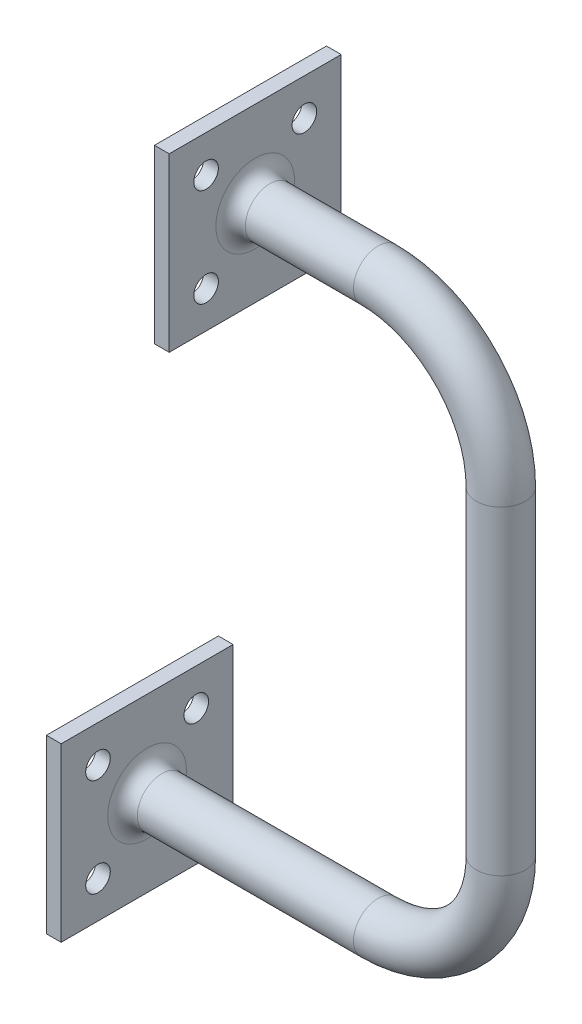
ISO-10303-21;
HEADER;
FILE_DESCRIPTION(('STEP AP214'),'2;1');
FILE_NAME('part.step','',(''),(''),'','','');
FILE_SCHEMA(('AUTOMOTIVE_DESIGN { 1 0 10303 214 1 1 1 1 }'));
ENDSEC;
DATA;
#1=APPLICATION_CONTEXT('core data for automotive mechanical design processes');
#2=APPLICATION_PROTOCOL_DEFINITION('international standard','automotive_design',2000,#1);
#3=PRODUCT_CONTEXT('',#1,'mechanical');
#4=PRODUCT('Part','Part','',(#3));
#5=PRODUCT_RELATED_PRODUCT_CATEGORY('part','',(#4));
#6=PRODUCT_DEFINITION_FORMATION('','',#4);
#7=PRODUCT_DEFINITION_CONTEXT('part definition',#1,'design');
#8=PRODUCT_DEFINITION('design','',#6,#7);
#9=PRODUCT_DEFINITION_SHAPE('','',#8);
#10=(LENGTH_UNIT() NAMED_UNIT(*) SI_UNIT(.MILLI.,.METRE.));
#11=(NAMED_UNIT(*) PLANE_ANGLE_UNIT() SI_UNIT($,.RADIAN.));
#12=(NAMED_UNIT(*) SI_UNIT($,.STERADIAN.) SOLID_ANGLE_UNIT());
#13=UNCERTAINTY_MEASURE_WITH_UNIT(LENGTH_MEASURE(1.E-05),#10,'distance_accuracy_value','');
#14=(GEOMETRIC_REPRESENTATION_CONTEXT(3) GLOBAL_UNCERTAINTY_ASSIGNED_CONTEXT((#13)) GLOBAL_UNIT_ASSIGNED_CONTEXT((#10,
#11,#12)) REPRESENTATION_CONTEXT('',''));
#15=CARTESIAN_POINT('',(0.,0.,0.));
#16=DIRECTION('',(0.,0.,1.));
#17=DIRECTION('',(1.,0.,0.));
#18=AXIS2_PLACEMENT_3D('',#15,#16,#17);
#19=CARTESIAN_POINT('',(3.,0.,0.));
#20=DIRECTION('',(-1.,0.,0.));
#21=DIRECTION('',(0.,0.,1.));
#22=AXIS2_PLACEMENT_3D('',#19,#20,#21);
#23=PLANE('',#22);
#24=CARTESIAN_POINT('',(3.,0.,0.));
#25=DIRECTION('',(-1.,0.,0.));
#26=DIRECTION('',(0.,0.,1.));
#27=AXIS2_PLACEMENT_3D('',#24,#25,#26);
#28=CIRCLE('',#27,8.);
#29=CARTESIAN_POINT('',(3.,0.,8.));
#30=VERTEX_POINT('',#29);
#31=EDGE_CURVE('E11',#30,#30,#28,.T.);
#32=ORIENTED_EDGE('',*,*,#31,.T.);
#33=EDGE_LOOP('',(#32));
#34=FACE_BOUND('',#33,.T.);
#35=CARTESIAN_POINT('',(3.,-10.,10.));
#36=DIRECTION('',(1.,0.,0.));
#37=DIRECTION('',(0.,0.,-1.));
#38=AXIS2_PLACEMENT_3D('',#35,#36,#37);
#39=CIRCLE('',#38,2.5);
#40=CARTESIAN_POINT('',(3.,-10.,7.5));
#41=VERTEX_POINT('',#40);
#42=EDGE_CURVE('E194',#41,#41,#39,.T.);
#43=ORIENTED_EDGE('',*,*,#42,.F.);
#44=EDGE_LOOP('',(#43));
#45=FACE_BOUND('',#44,.T.);
#46=CARTESIAN_POINT('',(3.,-10.,-10.));
#47=DIRECTION('',(1.,0.,0.));
#48=DIRECTION('',(0.,0.,-1.));
#49=AXIS2_PLACEMENT_3D('',#46,#47,#48);
#50=CIRCLE('',#49,2.5);
#51=CARTESIAN_POINT('',(3.,-10.,-12.5));
#52=VERTEX_POINT('',#51);
#53=EDGE_CURVE('E188',#52,#52,#50,.T.);
#54=ORIENTED_EDGE('',*,*,#53,.F.);
#55=EDGE_LOOP('',(#54));
#56=FACE_BOUND('',#55,.T.);
#57=DIRECTION('',(0.,1.,0.));
#58=VECTOR('',#57,1.);
#59=CARTESIAN_POINT('',(3.,-17.5,-17.5));
#60=LINE('',#59,#58);
#61=CARTESIAN_POINT('',(3.,-17.5,-17.5));
#62=VERTEX_POINT('',#61);
#63=CARTESIAN_POINT('',(3.,17.5,-17.5));
#64=VERTEX_POINT('',#63);
#65=EDGE_CURVE('E165',#62,#64,#60,.T.);
#66=ORIENTED_EDGE('',*,*,#65,.T.);
#67=DIRECTION('',(0.,0.,1.));
#68=VECTOR('',#67,1.);
#69=CARTESIAN_POINT('',(3.,17.5,17.5));
#70=LINE('',#69,#68);
#71=CARTESIAN_POINT('',(3.,17.5,17.5));
#72=VERTEX_POINT('',#71);
#73=EDGE_CURVE('E82',#64,#72,#70,.T.);
#74=ORIENTED_EDGE('',*,*,#73,.T.);
#75=DIRECTION('',(0.,-1.,0.));
#76=VECTOR('',#75,1.);
#77=CARTESIAN_POINT('',(3.,-17.5,17.5));
#78=LINE('',#77,#76);
#79=CARTESIAN_POINT('',(3.,-17.5,17.5));
#80=VERTEX_POINT('',#79);
#81=EDGE_CURVE('E168',#72,#80,#78,.T.);
#82=ORIENTED_EDGE('',*,*,#81,.T.);
#83=DIRECTION('',(0.,0.,-1.));
#84=VECTOR('',#83,1.);
#85=CARTESIAN_POINT('',(3.,-17.5,17.5));
#86=LINE('',#85,#84);
#87=EDGE_CURVE('E50',#80,#62,#86,.T.);
#88=ORIENTED_EDGE('',*,*,#87,.T.);
#89=EDGE_LOOP('',(#66,#74,#82,#88));
#90=FACE_BOUND('',#89,.T.);
#91=CARTESIAN_POINT('',(3.,10.,-10.));
#92=DIRECTION('',(1.,0.,0.));
#93=DIRECTION('',(0.,0.,-1.));
#94=AXIS2_PLACEMENT_3D('',#91,#92,#93);
#95=CIRCLE('',#94,2.5);
#96=CARTESIAN_POINT('',(3.,10.,-12.5));
#97=VERTEX_POINT('',#96);
#98=EDGE_CURVE('E158',#97,#97,#95,.T.);
#99=ORIENTED_EDGE('',*,*,#98,.F.);
#100=EDGE_LOOP('',(#99));
#101=FACE_BOUND('',#100,.T.);
#102=CARTESIAN_POINT('',(3.,10.,10.));
#103=DIRECTION('',(1.,0.,0.));
#104=DIRECTION('',(0.,0.,-1.));
#105=AXIS2_PLACEMENT_3D('',#102,#103,#104);
#106=CIRCLE('',#105,2.5);
#107=CARTESIAN_POINT('',(3.,10.,7.5));
#108=VERTEX_POINT('',#107);
#109=EDGE_CURVE('E155',#108,#108,#106,.T.);
#110=ORIENTED_EDGE('',*,*,#109,.F.);
#111=EDGE_LOOP('',(#110));
#112=FACE_BOUND('',#111,.T.);
#113=ADVANCED_FACE('F33',(#34,#45,#56,#90,#101,#112),#23,.F.);
#114=CARTESIAN_POINT('',(3.,-17.5,-17.5));
#115=DIRECTION('',(0.,0.,1.));
#116=DIRECTION('',(1.,0.,0.));
#117=AXIS2_PLACEMENT_3D('',#114,#115,#116);
#118=PLANE('',#117);
#119=DIRECTION('',(0.,1.,0.));
#120=VECTOR('',#119,1.);
#121=CARTESIAN_POINT('',(0.,-17.5,-17.5));
#122=LINE('',#121,#120);
#123=CARTESIAN_POINT('',(0.,-17.5,-17.5));
#124=VERTEX_POINT('',#123);
#125=CARTESIAN_POINT('',(0.,17.5,-17.5));
#126=VERTEX_POINT('',#125);
#127=EDGE_CURVE('E162',#124,#126,#122,.T.);
#128=ORIENTED_EDGE('',*,*,#127,.T.);
#129=DIRECTION('',(-1.,0.,0.));
#130=VECTOR('',#129,1.);
#131=CARTESIAN_POINT('',(3.,17.5,-17.5));
#132=LINE('',#131,#130);
#133=EDGE_CURVE('E183',#64,#126,#132,.T.);
#134=ORIENTED_EDGE('',*,*,#133,.F.);
#135=ORIENTED_EDGE('',*,*,#65,.F.);
#136=DIRECTION('',(-1.,0.,0.));
#137=VECTOR('',#136,1.);
#138=CARTESIAN_POINT('',(3.,-17.5,-17.5));
#139=LINE('',#138,#137);
#140=EDGE_CURVE('E171',#62,#124,#139,.T.);
#141=ORIENTED_EDGE('',*,*,#140,.T.);
#142=EDGE_LOOP('',(#128,#134,#135,#141));
#143=FACE_BOUND('',#142,.T.);
#144=ADVANCED_FACE('F234',(#143),#118,.F.);
#145=CARTESIAN_POINT('',(3.,17.5,17.5));
#146=DIRECTION('',(0.,-1.,0.));
#147=DIRECTION('',(0.,0.,-1.));
#148=AXIS2_PLACEMENT_3D('',#145,#146,#147);
#149=PLANE('',#148);
#150=DIRECTION('',(0.,0.,1.));
#151=VECTOR('',#150,1.);
#152=CARTESIAN_POINT('',(0.,17.5,17.5));
#153=LINE('',#152,#151);
#154=CARTESIAN_POINT('',(0.,17.5,17.5));
#155=VERTEX_POINT('',#154);
#156=EDGE_CURVE('E174',#126,#155,#153,.T.);
#157=ORIENTED_EDGE('',*,*,#156,.T.);
#158=DIRECTION('',(-1.,0.,0.));
#159=VECTOR('',#158,1.);
#160=CARTESIAN_POINT('',(3.,17.5,17.5));
#161=LINE('',#160,#159);
#162=EDGE_CURVE('E181',#72,#155,#161,.T.);
#163=ORIENTED_EDGE('',*,*,#162,.F.);
#164=ORIENTED_EDGE('',*,*,#73,.F.);
#165=ORIENTED_EDGE('',*,*,#133,.T.);
#166=EDGE_LOOP('',(#157,#163,#164,#165));
#167=FACE_BOUND('',#166,.T.);
#168=ADVANCED_FACE('F242',(#167),#149,.F.);
#169=CARTESIAN_POINT('',(3.,-17.5,17.5));
#170=DIRECTION('',(0.,0.,-1.));
#171=DIRECTION('',(-1.,0.,0.));
#172=AXIS2_PLACEMENT_3D('',#169,#170,#171);
#173=PLANE('',#172);
#174=DIRECTION('',(0.,-1.,0.));
#175=VECTOR('',#174,1.);
#176=CARTESIAN_POINT('',(0.,-17.5,17.5));
#177=LINE('',#176,#175);
#178=CARTESIAN_POINT('',(0.,-17.5,17.5));
#179=VERTEX_POINT('',#178);
#180=EDGE_CURVE('E68',#155,#179,#177,.T.);
#181=ORIENTED_EDGE('',*,*,#180,.T.);
#182=DIRECTION('',(-1.,0.,0.));
#183=VECTOR('',#182,1.);
#184=CARTESIAN_POINT('',(3.,-17.5,17.5));
#185=LINE('',#184,#183);
#186=EDGE_CURVE('E179',#80,#179,#185,.T.);
#187=ORIENTED_EDGE('',*,*,#186,.F.);
#188=ORIENTED_EDGE('',*,*,#81,.F.);
#189=ORIENTED_EDGE('',*,*,#162,.T.);
#190=EDGE_LOOP('',(#181,#187,#188,#189));
#191=FACE_BOUND('',#190,.T.);
#192=ADVANCED_FACE('F257',(#191),#173,.F.);
#193=CARTESIAN_POINT('',(3.,-17.5,17.5));
#194=DIRECTION('',(0.,1.,0.));
#195=DIRECTION('',(0.,0.,1.));
#196=AXIS2_PLACEMENT_3D('',#193,#194,#195);
#197=PLANE('',#196);
#198=DIRECTION('',(0.,0.,-1.));
#199=VECTOR('',#198,1.);
#200=CARTESIAN_POINT('',(0.,-17.5,17.5));
#201=LINE('',#200,#199);
#202=EDGE_CURVE('E74',#179,#124,#201,.T.);
#203=ORIENTED_EDGE('',*,*,#202,.T.);
#204=ORIENTED_EDGE('',*,*,#140,.F.);
#205=ORIENTED_EDGE('',*,*,#87,.F.);
#206=ORIENTED_EDGE('',*,*,#186,.T.);
#207=EDGE_LOOP('',(#203,#204,#205,#206));
#208=FACE_BOUND('',#207,.T.);
#209=ADVANCED_FACE('F253',(#208),#197,.F.);
#210=CARTESIAN_POINT('',(0.,0.,0.));
#211=DIRECTION('',(-1.,0.,0.));
#212=DIRECTION('',(0.,0.,1.));
#213=AXIS2_PLACEMENT_3D('',#210,#211,#212);
#214=PLANE('',#213);
#215=CARTESIAN_POINT('',(0.,10.,10.));
#216=DIRECTION('',(1.,0.,0.));
#217=DIRECTION('',(0.,0.,-1.));
#218=AXIS2_PLACEMENT_3D('',#215,#216,#217);
#219=CIRCLE('',#218,2.5);
#220=CARTESIAN_POINT('',(0.,10.,7.5));
#221=VERTEX_POINT('',#220);
#222=EDGE_CURVE('E152',#221,#221,#219,.T.);
#223=ORIENTED_EDGE('',*,*,#222,.T.);
#224=EDGE_LOOP('',(#223));
#225=FACE_BOUND('',#224,.T.);
#226=CARTESIAN_POINT('',(0.,10.,-10.));
#227=DIRECTION('',(1.,0.,0.));
#228=DIRECTION('',(0.,0.,-1.));
#229=AXIS2_PLACEMENT_3D('',#226,#227,#228);
#230=CIRCLE('',#229,2.5);
#231=CARTESIAN_POINT('',(0.,10.,-12.5));
#232=VERTEX_POINT('',#231);
#233=EDGE_CURVE('E159',#232,#232,#230,.T.);
#234=ORIENTED_EDGE('',*,*,#233,.T.);
#235=EDGE_LOOP('',(#234));
#236=FACE_BOUND('',#235,.T.);
#237=ORIENTED_EDGE('',*,*,#127,.F.);
#238=ORIENTED_EDGE('',*,*,#202,.F.);
#239=ORIENTED_EDGE('',*,*,#180,.F.);
#240=ORIENTED_EDGE('',*,*,#156,.F.);
#241=EDGE_LOOP('',(#237,#238,#239,#240));
#242=FACE_BOUND('',#241,.T.);
#243=CARTESIAN_POINT('',(0.,-10.,-10.));
#244=DIRECTION('',(1.,0.,0.));
#245=DIRECTION('',(0.,0.,-1.));
#246=AXIS2_PLACEMENT_3D('',#243,#244,#245);
#247=CIRCLE('',#246,2.5);
#248=CARTESIAN_POINT('',(0.,-10.,-12.5));
#249=VERTEX_POINT('',#248);
#250=EDGE_CURVE('E185',#249,#249,#247,.T.);
#251=ORIENTED_EDGE('',*,*,#250,.T.);
#252=EDGE_LOOP('',(#251));
#253=FACE_BOUND('',#252,.T.);
#254=CARTESIAN_POINT('',(0.,-10.,10.));
#255=DIRECTION('',(1.,0.,0.));
#256=DIRECTION('',(0.,0.,-1.));
#257=AXIS2_PLACEMENT_3D('',#254,#255,#256);
#258=CIRCLE('',#257,2.5);
#259=CARTESIAN_POINT('',(0.,-10.,7.5));
#260=VERTEX_POINT('',#259);
#261=EDGE_CURVE('E191',#260,#260,#258,.T.);
#262=ORIENTED_EDGE('',*,*,#261,.T.);
#263=EDGE_LOOP('',(#262));
#264=FACE_BOUND('',#263,.T.);
#265=ADVANCED_FACE('F250',(#225,#236,#242,#253,#264),#214,.T.);
#266=CARTESIAN_POINT('',(0.,10.,-10.));
#267=DIRECTION('',(1.,0.,0.));
#268=DIRECTION('',(0.,0.,-1.));
#269=AXIS2_PLACEMENT_3D('',#266,#267,#268);
#270=CYLINDRICAL_SURFACE('',#269,2.5);
#271=ORIENTED_EDGE('',*,*,#233,.F.);
#272=EDGE_LOOP('',(#271));
#273=FACE_BOUND('',#272,.T.);
#274=ORIENTED_EDGE('',*,*,#98,.T.);
#275=EDGE_LOOP('',(#274));
#276=FACE_BOUND('',#275,.T.);
#277=ADVANCED_FACE('F248',(#273,#276),#270,.F.);
#278=CARTESIAN_POINT('',(0.,10.,10.));
#279=DIRECTION('',(1.,0.,0.));
#280=DIRECTION('',(0.,0.,-1.));
#281=AXIS2_PLACEMENT_3D('',#278,#279,#280);
#282=CYLINDRICAL_SURFACE('',#281,2.5);
#283=ORIENTED_EDGE('',*,*,#222,.F.);
#284=EDGE_LOOP('',(#283));
#285=FACE_BOUND('',#284,.T.);
#286=ORIENTED_EDGE('',*,*,#109,.T.);
#287=EDGE_LOOP('',(#286));
#288=FACE_BOUND('',#287,.T.);
#289=ADVANCED_FACE('F266',(#285,#288),#282,.F.);
#290=CARTESIAN_POINT('',(0.,-10.,-10.));
#291=DIRECTION('',(1.,0.,0.));
#292=DIRECTION('',(0.,0.,-1.));
#293=AXIS2_PLACEMENT_3D('',#290,#291,#292);
#294=CYLINDRICAL_SURFACE('',#293,2.5);
#295=ORIENTED_EDGE('',*,*,#250,.F.);
#296=EDGE_LOOP('',(#295));
#297=FACE_BOUND('',#296,.T.);
#298=ORIENTED_EDGE('',*,*,#53,.T.);
#299=EDGE_LOOP('',(#298));
#300=FACE_BOUND('',#299,.T.);
#301=ADVANCED_FACE('F262',(#297,#300),#294,.F.);
#302=CARTESIAN_POINT('',(0.,-10.,10.));
#303=DIRECTION('',(1.,0.,0.));
#304=DIRECTION('',(0.,0.,-1.));
#305=AXIS2_PLACEMENT_3D('',#302,#303,#304);
#306=CYLINDRICAL_SURFACE('',#305,2.5);
#307=ORIENTED_EDGE('',*,*,#261,.F.);
#308=EDGE_LOOP('',(#307));
#309=FACE_BOUND('',#308,.T.);
#310=ORIENTED_EDGE('',*,*,#42,.T.);
#311=EDGE_LOOP('',(#310));
#312=FACE_BOUND('',#311,.T.);
#313=ADVANCED_FACE('F265',(#309,#312),#306,.F.);
#314=CARTESIAN_POINT('',(50.0000004998067,115.000000499807,0.));
#315=DIRECTION('',(-1.,0.,0.));
#316=DIRECTION('',(0.,0.,1.));
#317=AXIS2_PLACEMENT_3D('',#314,#315,#316);
#318=CYLINDRICAL_SURFACE('',#317,5.);
#319=CARTESIAN_POINT('',(28.0000004998066,115.000000499807,0.));
#320=DIRECTION('',(1.,1.99902673779308E-08,0.));
#321=DIRECTION('',(-1.99902673779308E-08,1.,0.));
#322=AXIS2_PLACEMENT_3D('',#319,#320,#321);
#323=CIRCLE('',#322,5.);
#324=CARTESIAN_POINT('',(28.0000004998066,115.000000499807,5.));
#325=VERTEX_POINT('',#324);
#326=EDGE_CURVE('E216',#325,#325,#323,.T.);
#327=CARTESIAN_POINT('',(50.0000004998067,115.000000499807,0.));
#328=DIRECTION('',(-1.,-1.99902673189074E-08,0.));
#329=DIRECTION('',(0.,0.,-1.));
#330=AXIS2_PLACEMENT_3D('',#327,#328,#329);
#331=CIRCLE('',#330,5.);
#332=CARTESIAN_POINT('',(50.0000004998067,115.000000499807,5.));
#333=VERTEX_POINT('',#332);
#334=EDGE_CURVE('E149',#333,#333,#331,.T.);
#335=CARTESIAN_POINT('',(28.0000004998066,115.000000499807,5.));
#336=CARTESIAN_POINT('',(28.2291671664733,115.000000499807,5.));
#337=CARTESIAN_POINT('',(28.45833383314,115.000000499807,5.));
#338=CARTESIAN_POINT('',(28.9166671664733,115.000000499807,5.));
#339=CARTESIAN_POINT('',(29.14583383314,115.000000499807,5.));
#340=CARTESIAN_POINT('',(29.6041671664733,115.000000499807,5.));
#341=CARTESIAN_POINT('',(29.83333383314,115.000000499807,5.));
#342=CARTESIAN_POINT('',(30.2916671664733,115.000000499807,5.));
#343=CARTESIAN_POINT('',(30.52083383314,115.000000499807,5.));
#344=CARTESIAN_POINT('',(30.9791671664733,115.000000499807,5.));
#345=CARTESIAN_POINT('',(31.20833383314,115.000000499807,5.));
#346=CARTESIAN_POINT('',(31.6666671664733,115.000000499807,5.));
#347=CARTESIAN_POINT('',(31.89583383314,115.000000499807,5.));
#348=CARTESIAN_POINT('',(32.3541671664733,115.000000499807,5.));
#349=CARTESIAN_POINT('',(32.58333383314,115.000000499807,5.));
#350=CARTESIAN_POINT('',(33.0416671664733,115.000000499807,5.));
#351=CARTESIAN_POINT('',(33.27083383314,115.000000499807,5.));
#352=CARTESIAN_POINT('',(33.7291671664733,115.000000499807,5.));
#353=CARTESIAN_POINT('',(33.95833383314,115.000000499807,5.));
#354=CARTESIAN_POINT('',(34.4166671664733,115.000000499807,5.));
#355=CARTESIAN_POINT('',(34.64583383314,115.000000499807,5.));
#356=CARTESIAN_POINT('',(35.1041671664733,115.000000499807,5.));
#357=CARTESIAN_POINT('',(35.33333383314,115.000000499807,5.));
#358=CARTESIAN_POINT('',(35.7916671664733,115.000000499807,5.));
#359=CARTESIAN_POINT('',(36.02083383314,115.000000499807,5.));
#360=CARTESIAN_POINT('',(36.4791671664733,115.000000499807,5.));
#361=CARTESIAN_POINT('',(36.70833383314,115.000000499807,5.));
#362=CARTESIAN_POINT('',(37.1666671664733,115.000000499807,5.));
#363=CARTESIAN_POINT('',(37.39583383314,115.000000499807,5.));
#364=CARTESIAN_POINT('',(37.8541671664733,115.000000499807,5.));
#365=CARTESIAN_POINT('',(38.08333383314,115.000000499807,5.));
#366=CARTESIAN_POINT('',(38.5416671664733,115.000000499807,5.));
#367=CARTESIAN_POINT('',(38.77083383314,115.000000499807,5.));
#368=CARTESIAN_POINT('',(39.2291671664733,115.000000499807,5.));
#369=CARTESIAN_POINT('',(39.45833383314,115.000000499807,5.));
#370=CARTESIAN_POINT('',(39.9166671664733,115.000000499807,5.));
#371=CARTESIAN_POINT('',(40.14583383314,115.000000499807,5.));
#372=CARTESIAN_POINT('',(40.6041671664733,115.000000499807,5.));
#373=CARTESIAN_POINT('',(40.83333383314,115.000000499807,5.));
#374=CARTESIAN_POINT('',(41.2916671664733,115.000000499807,5.));
#375=CARTESIAN_POINT('',(41.52083383314,115.000000499807,5.));
#376=CARTESIAN_POINT('',(41.9791671664733,115.000000499807,5.));
#377=CARTESIAN_POINT('',(42.20833383314,115.000000499807,5.));
#378=CARTESIAN_POINT('',(42.6666671664733,115.000000499807,5.));
#379=CARTESIAN_POINT('',(42.89583383314,115.000000499807,5.));
#380=CARTESIAN_POINT('',(43.3541671664733,115.000000499807,5.));
#381=CARTESIAN_POINT('',(43.58333383314,115.000000499807,5.));
#382=CARTESIAN_POINT('',(44.0416671664733,115.000000499807,5.));
#383=CARTESIAN_POINT('',(44.27083383314,115.000000499807,5.));
#384=CARTESIAN_POINT('',(44.7291671664733,115.000000499807,5.));
#385=CARTESIAN_POINT('',(44.95833383314,115.000000499807,5.));
#386=CARTESIAN_POINT('',(45.4166671664733,115.000000499807,5.));
#387=CARTESIAN_POINT('',(45.64583383314,115.000000499807,5.));
#388=CARTESIAN_POINT('',(46.1041671664733,115.000000499807,5.));
#389=CARTESIAN_POINT('',(46.33333383314,115.000000499807,5.));
#390=CARTESIAN_POINT('',(46.7916671664733,115.000000499807,5.));
#391=CARTESIAN_POINT('',(47.02083383314,115.000000499807,5.));
#392=CARTESIAN_POINT('',(47.4791671664733,115.000000499807,5.));
#393=CARTESIAN_POINT('',(47.70833383314,115.000000499807,5.));
#394=CARTESIAN_POINT('',(48.1666671664733,115.000000499807,5.));
#395=CARTESIAN_POINT('',(48.39583383314,115.000000499807,5.));
#396=CARTESIAN_POINT('',(48.8541671664733,115.000000499807,5.));
#397=CARTESIAN_POINT('',(49.08333383314,115.000000499807,5.));
#398=CARTESIAN_POINT('',(49.5416671664733,115.000000499807,5.));
#399=CARTESIAN_POINT('',(49.77083383314,115.000000499807,5.));
#400=CARTESIAN_POINT('',(50.0000004998067,115.000000499807,5.));
#401=B_SPLINE_CURVE_WITH_KNOTS('',3,(#335,#336,#337,#338,#339,#340,#341,#342,#343,#344,#345,
#346,#347,#348,#349,#350,#351,#352,#353,#354,#355,#356,#357,#358,#359,#360,#361,#362,#363,#364,
#365,#366,#367,#368,#369,#370,#371,#372,#373,#374,#375,#376,#377,#378,#379,#380,#381,#382,#383,
#384,#385,#386,#387,#388,#389,#390,#391,#392,#393,#394,#395,#396,#397,#398,#399,#400),
.UNSPECIFIED.,.F.,.F.,(4,2,2,2,2,2,2,2,2,2,2,2,2,2,2,2,2,2,2,2,2,2,2,2,2,2,2,2,2,2,2,2,4),(0.,
0.687500000000001,1.375,2.0625,2.75,3.4375,4.125,4.8125,5.50000000000001,6.18750000000001,
6.87500000000001,7.56250000000001,8.25000000000001,8.93750000000001,9.62500000000002,10.3125,
11.,11.6875,12.375,13.0625,13.75,14.4375,15.125,15.8125,16.5,17.1875,17.875,18.5625,19.25,
19.9375,20.625,21.3125,22.),.UNSPECIFIED.);
#402=EDGE_CURVE('BSEAM270',#325,#333,#401,.T.);
#403=ORIENTED_EDGE('',*,*,#326,.T.);
#404=ORIENTED_EDGE('',*,*,#334,.T.);
#405=ORIENTED_EDGE('',*,*,#402,.T.);
#406=ORIENTED_EDGE('',*,*,#402,.F.);
#407=EDGE_LOOP('',(#403,#405,#404,#406));
#408=FACE_BOUND('',#407,.T.);
#409=ADVANCED_FACE('F270',(#408),#318,.T.);
#410=CARTESIAN_POINT('',(50.0000004998067,90.,0.));
#411=DIRECTION('',(0.,0.,1.));
#412=DIRECTION('',(1.,0.,0.));
#413=AXIS2_PLACEMENT_3D('',#410,#411,#412);
#414=TOROIDAL_SURFACE('',#413,25.0000004998067,5.);
#415=CARTESIAN_POINT('',(75.0000009996133,90.,0.));
#416=DIRECTION('',(-1.99902673801398E-08,1.,0.));
#417=DIRECTION('',(0.,0.,-1.));
#418=AXIS2_PLACEMENT_3D('',#415,#416,#417);
#419=CIRCLE('',#418,5.);
#420=CARTESIAN_POINT('',(75.0000009996133,90.,5.));
#421=VERTEX_POINT('',#420);
#422=EDGE_CURVE('E146',#421,#421,#419,.T.);
#423=ORIENTED_EDGE('',*,*,#422,.T.);
#424=EDGE_LOOP('',(#423));
#425=FACE_BOUND('',#424,.T.);
#426=ORIENTED_EDGE('',*,*,#334,.F.);
#427=EDGE_LOOP('',(#426));
#428=FACE_BOUND('',#427,.T.);
#429=ADVANCED_FACE('F321',(#425,#428),#414,.T.);
#430=CARTESIAN_POINT('',(75.0000009996133,25.0000004998566,0.));
#431=DIRECTION('',(0.,1.,0.));
#432=DIRECTION('',(0.,0.,1.));
#433=AXIS2_PLACEMENT_3D('',#430,#431,#432);
#434=CYLINDRICAL_SURFACE('',#433,5.);
#435=CARTESIAN_POINT('',(75.0000009996133,25.0000004998566,0.));
#436=DIRECTION('',(-1.99902673801398E-08,1.,0.));
#437=DIRECTION('',(0.,0.,-1.));
#438=AXIS2_PLACEMENT_3D('',#435,#436,#437);
#439=CIRCLE('',#438,5.);
#440=CARTESIAN_POINT('',(75.0000009996133,25.0000004998566,5.));
#441=VERTEX_POINT('',#440);
#442=EDGE_CURVE('E138',#441,#441,#439,.T.);
#443=CARTESIAN_POINT('',(75.0000009996133,25.0000004998566,5.));
#444=CARTESIAN_POINT('',(75.0000009996133,25.6770838279831,5.));
#445=CARTESIAN_POINT('',(75.0000009996133,26.3541671561096,5.));
#446=CARTESIAN_POINT('',(75.0000009996133,27.7083338123626,5.));
#447=CARTESIAN_POINT('',(75.0000009996133,28.3854171404891,5.));
#448=CARTESIAN_POINT('',(75.0000009996133,29.7395837967421,5.));
#449=CARTESIAN_POINT('',(75.0000009996133,30.4166671248686,5.));
#450=CARTESIAN_POINT('',(75.0000009996133,31.7708337811216,5.));
#451=CARTESIAN_POINT('',(75.0000009996133,32.4479171092481,5.));
#452=CARTESIAN_POINT('',(75.0000009996133,33.802083765501,5.));
#453=CARTESIAN_POINT('',(75.0000009996133,34.4791670936275,5.));
#454=CARTESIAN_POINT('',(75.0000009996133,35.8333337498805,5.));
#455=CARTESIAN_POINT('',(75.0000009996133,36.510417078007,5.));
#456=CARTESIAN_POINT('',(75.0000009996133,37.86458373426,5.));
#457=CARTESIAN_POINT('',(75.0000009996133,38.5416670623865,5.));
#458=CARTESIAN_POINT('',(75.0000009996133,39.8958337186395,5.));
#459=CARTESIAN_POINT('',(75.0000009996133,40.572917046766,5.));
#460=CARTESIAN_POINT('',(75.0000009996133,41.927083703019,5.));
#461=CARTESIAN_POINT('',(75.0000009996133,42.6041670311455,5.));
#462=CARTESIAN_POINT('',(75.0000009996133,43.9583336873984,5.));
#463=CARTESIAN_POINT('',(75.0000009996133,44.6354170155249,5.));
#464=CARTESIAN_POINT('',(75.0000009996133,45.9895836717779,5.));
#465=CARTESIAN_POINT('',(75.0000009996133,46.6666669999044,5.));
#466=CARTESIAN_POINT('',(75.0000009996133,48.0208336561574,5.));
#467=CARTESIAN_POINT('',(75.0000009996133,48.6979169842839,5.));
#468=CARTESIAN_POINT('',(75.0000009996133,50.0520836405369,5.));
#469=CARTESIAN_POINT('',(75.0000009996133,50.7291669686634,5.));
#470=CARTESIAN_POINT('',(75.0000009996133,52.0833336249164,5.));
#471=CARTESIAN_POINT('',(75.0000009996133,52.7604169530429,5.));
#472=CARTESIAN_POINT('',(75.0000009996133,54.1145836092958,5.));
#473=CARTESIAN_POINT('',(75.0000009996133,54.7916669374223,5.));
#474=CARTESIAN_POINT('',(75.0000009996133,56.1458335936753,5.));
#475=CARTESIAN_POINT('',(75.0000009996133,56.8229169218018,5.));
#476=CARTESIAN_POINT('',(75.0000009996133,58.1770835780548,5.));
#477=CARTESIAN_POINT('',(75.0000009996133,58.8541669061813,5.));
#478=CARTESIAN_POINT('',(75.0000009996133,60.2083335624343,5.));
#479=CARTESIAN_POINT('',(75.0000009996133,60.8854168905608,5.));
#480=CARTESIAN_POINT('',(75.0000009996133,62.2395835468138,5.));
#481=CARTESIAN_POINT('',(75.0000009996133,62.9166668749403,5.));
#482=CARTESIAN_POINT('',(75.0000009996133,64.2708335311932,5.));
#483=CARTESIAN_POINT('',(75.0000009996133,64.9479168593197,5.));
#484=CARTESIAN_POINT('',(75.0000009996133,66.3020835155727,5.));
#485=CARTESIAN_POINT('',(75.0000009996133,66.9791668436992,5.));
#486=CARTESIAN_POINT('',(75.0000009996133,68.3333334999522,5.));
#487=CARTESIAN_POINT('',(75.0000009996133,69.0104168280787,5.));
#488=CARTESIAN_POINT('',(75.0000009996133,70.3645834843317,5.));
#489=CARTESIAN_POINT('',(75.0000009996133,71.0416668124582,5.));
#490=CARTESIAN_POINT('',(75.0000009996133,72.3958334687112,5.));
#491=CARTESIAN_POINT('',(75.0000009996133,73.0729167968377,5.));
#492=CARTESIAN_POINT('',(75.0000009996133,74.4270834530907,5.));
#493=CARTESIAN_POINT('',(75.0000009996133,75.1041667812171,5.));
#494=CARTESIAN_POINT('',(75.0000009996133,76.4583334374701,5.));
#495=CARTESIAN_POINT('',(75.0000009996133,77.1354167655966,5.));
#496=CARTESIAN_POINT('',(75.0000009996133,78.4895834218496,5.));
#497=CARTESIAN_POINT('',(75.0000009996133,79.1666667499761,5.));
#498=CARTESIAN_POINT('',(75.0000009996133,80.5208334062291,5.));
#499=CARTESIAN_POINT('',(75.0000009996133,81.1979167343556,5.));
#500=CARTESIAN_POINT('',(75.0000009996133,82.5520833906086,5.));
#501=CARTESIAN_POINT('',(75.0000009996133,83.2291667187351,5.));
#502=CARTESIAN_POINT('',(75.0000009996133,84.5833333749881,5.));
#503=CARTESIAN_POINT('',(75.0000009996133,85.2604167031145,5.));
#504=CARTESIAN_POINT('',(75.0000009996133,86.6145833593675,5.));
#505=CARTESIAN_POINT('',(75.0000009996133,87.291666687494,5.));
#506=CARTESIAN_POINT('',(75.0000009996133,88.645833343747,5.));
#507=CARTESIAN_POINT('',(75.0000009996133,89.3229166718735,5.));
#508=CARTESIAN_POINT('',(75.0000009996133,90.,5.));
#509=B_SPLINE_CURVE_WITH_KNOTS('',3,(#443,#444,#445,#446,#447,#448,#449,#450,#451,#452,#453,
#454,#455,#456,#457,#458,#459,#460,#461,#462,#463,#464,#465,#466,#467,#468,#469,#470,#471,#472,
#473,#474,#475,#476,#477,#478,#479,#480,#481,#482,#483,#484,#485,#486,#487,#488,#489,#490,#491,
#492,#493,#494,#495,#496,#497,#498,#499,#500,#501,#502,#503,#504,#505,#506,#507,#508),
.UNSPECIFIED.,.F.,.F.,(4,2,2,2,2,2,2,2,2,2,2,2,2,2,2,2,2,2,2,2,2,2,2,2,2,2,2,2,2,2,2,2,4),(0.,
2.03124998437948,4.06249996875896,6.09374995313844,8.12499993751793,10.1562499218974,
12.1874999062769,14.2187498906564,16.2499998750358,18.2812498594153,20.3124998437948,
22.3437498281743,24.3749998125538,26.4062497969332,28.4374997813127,30.4687497656922,
32.4999997500717,34.5312497344512,36.5624997188306,38.5937497032101,40.6249996875896,
42.6562496719691,44.6874996563486,46.7187496407281,48.7499996251075,50.781249609487,
52.8124995938665,54.843749578246,56.8749995626255,58.9062495470049,60.9374995313844,
62.9687495157639,64.9999995001434),.UNSPECIFIED.);
#510=EDGE_CURVE('BSEAM317',#441,#421,#509,.T.);
#511=ORIENTED_EDGE('',*,*,#442,.T.);
#512=ORIENTED_EDGE('',*,*,#422,.F.);
#513=ORIENTED_EDGE('',*,*,#510,.T.);
#514=ORIENTED_EDGE('',*,*,#510,.F.);
#515=EDGE_LOOP('',(#511,#513,#512,#514));
#516=FACE_BOUND('',#515,.T.);
#517=ADVANCED_FACE('F317',(#516),#434,.T.);
#518=CARTESIAN_POINT('',(50.0000004997567,25.0000004998566,0.));
#519=DIRECTION('',(0.,0.,1.));
#520=DIRECTION('',(1.,0.,0.));
#521=AXIS2_PLACEMENT_3D('',#518,#519,#520);
#522=TOROIDAL_SURFACE('',#521,25.0000004998566,5.);
#523=CARTESIAN_POINT('',(50.,0.,0.));
#524=DIRECTION('',(1.,0.,0.));
#525=DIRECTION('',(0.,0.,-1.));
#526=AXIS2_PLACEMENT_3D('',#523,#524,#525);
#527=CIRCLE('',#526,5.);
#528=CARTESIAN_POINT('',(50.,0.,-5.));
#529=VERTEX_POINT('',#528);
#530=EDGE_CURVE('E135',#529,#529,#527,.T.);
#531=ORIENTED_EDGE('',*,*,#530,.T.);
#532=EDGE_LOOP('',(#531));
#533=FACE_BOUND('',#532,.T.);
#534=ORIENTED_EDGE('',*,*,#442,.F.);
#535=EDGE_LOOP('',(#534));
#536=FACE_BOUND('',#535,.T.);
#537=ADVANCED_FACE('F314',(#533,#536),#522,.T.);
#538=CARTESIAN_POINT('',(50.,0.,0.));
#539=DIRECTION('',(-1.,0.,0.));
#540=DIRECTION('',(0.,-1.,0.));
#541=AXIS2_PLACEMENT_3D('',#538,#539,#540);
#542=CYLINDRICAL_SURFACE('',#541,5.);
#543=CARTESIAN_POINT('',(6.,0.,0.));
#544=DIRECTION('',(-1.,0.,0.));
#545=DIRECTION('',(0.,0.,1.));
#546=AXIS2_PLACEMENT_3D('',#543,#544,#545);
#547=CIRCLE('',#546,5.);
#548=CARTESIAN_POINT('',(6.,0.,5.));
#549=VERTEX_POINT('',#548);
#550=EDGE_CURVE('E42',#549,#549,#547,.F.);
#551=ORIENTED_EDGE('',*,*,#550,.T.);
#552=EDGE_LOOP('',(#551));
#553=FACE_BOUND('',#552,.T.);
#554=ORIENTED_EDGE('',*,*,#530,.F.);
#555=EDGE_LOOP('',(#554));
#556=FACE_BOUND('',#555,.T.);
#557=ADVANCED_FACE('F221',(#553,#556),#542,.T.);
#558=CARTESIAN_POINT('',(22.0000008496363,97.4999999400791,17.5));
#559=DIRECTION('',(0.,0.,-1.));
#560=DIRECTION('',(-1.,0.,0.));
#561=AXIS2_PLACEMENT_3D('',#558,#559,#560);
#562=PLANE('',#561);
#563=DIRECTION('',(-1.99902673779308E-08,1.,0.));
#564=VECTOR('',#563,1.);
#565=CARTESIAN_POINT('',(25.0000008496363,97.5000000000499,17.5));
#566=LINE('',#565,#564);
#567=CARTESIAN_POINT('',(25.0000008496363,97.5000000000499,17.5));
#568=VERTEX_POINT('',#567);
#569=CARTESIAN_POINT('',(25.000000149977,132.50000000005,17.5));
#570=VERTEX_POINT('',#569);
#571=EDGE_CURVE('E134',#568,#570,#566,.T.);
#572=ORIENTED_EDGE('',*,*,#571,.T.);
#573=DIRECTION('',(1.,1.99902673189074E-08,0.));
#574=VECTOR('',#573,1.);
#575=CARTESIAN_POINT('',(22.000000149977,132.499999940079,17.5));
#576=LINE('',#575,#574);
#577=CARTESIAN_POINT('',(22.000000149977,132.499999940079,17.5));
#578=VERTEX_POINT('',#577);
#579=EDGE_CURVE('E113',#578,#570,#576,.T.);
#580=ORIENTED_EDGE('',*,*,#579,.F.);
#581=DIRECTION('',(-1.99902673779308E-08,1.,0.));
#582=VECTOR('',#581,1.);
#583=CARTESIAN_POINT('',(22.0000008496363,97.4999999400791,17.5));
#584=LINE('',#583,#582);
#585=CARTESIAN_POINT('',(22.0000008496363,97.4999999400791,17.5));
#586=VERTEX_POINT('',#585);
#587=EDGE_CURVE('E120',#586,#578,#584,.T.);
#588=ORIENTED_EDGE('',*,*,#587,.F.);
#589=DIRECTION('',(1.,1.99902673189074E-08,0.));
#590=VECTOR('',#589,1.);
#591=CARTESIAN_POINT('',(22.0000008496363,97.4999999400791,17.5));
#592=LINE('',#591,#590);
#593=EDGE_CURVE('E515',#586,#568,#592,.T.);
#594=ORIENTED_EDGE('',*,*,#593,.T.);
#595=EDGE_LOOP('',(#572,#580,#588,#594));
#596=FACE_BOUND('',#595,.T.);
#597=ADVANCED_FACE('F132',(#596),#562,.F.);
#598=CARTESIAN_POINT('',(22.000000149977,132.499999940079,-17.5));
#599=DIRECTION('',(1.99902673189074E-08,-1.,0.));
#600=DIRECTION('',(1.,1.99902673189074E-08,0.));
#601=AXIS2_PLACEMENT_3D('',#598,#599,#600);
#602=PLANE('',#601);
#603=DIRECTION('',(0.,0.,-1.));
#604=VECTOR('',#603,1.);
#605=CARTESIAN_POINT('',(25.000000149977,132.50000000005,-17.5));
#606=LINE('',#605,#604);
#607=CARTESIAN_POINT('',(25.000000149977,132.50000000005,-17.5));
#608=VERTEX_POINT('',#607);
#609=EDGE_CURVE('E517',#570,#608,#606,.T.);
#610=ORIENTED_EDGE('',*,*,#609,.T.);
#611=DIRECTION('',(1.,1.99902673189074E-08,0.));
#612=VECTOR('',#611,1.);
#613=CARTESIAN_POINT('',(22.000000149977,132.499999940079,-17.5));
#614=LINE('',#613,#612);
#615=CARTESIAN_POINT('',(22.000000149977,132.499999940079,-17.5));
#616=VERTEX_POINT('',#615);
#617=EDGE_CURVE('E116',#616,#608,#614,.T.);
#618=ORIENTED_EDGE('',*,*,#617,.F.);
#619=DIRECTION('',(0.,0.,-1.));
#620=VECTOR('',#619,1.);
#621=CARTESIAN_POINT('',(22.000000149977,132.499999940079,-17.5));
#622=LINE('',#621,#620);
#623=EDGE_CURVE('E109',#578,#616,#622,.T.);
#624=ORIENTED_EDGE('',*,*,#623,.F.);
#625=ORIENTED_EDGE('',*,*,#579,.T.);
#626=EDGE_LOOP('',(#610,#618,#624,#625));
#627=FACE_BOUND('',#626,.T.);
#628=ADVANCED_FACE('F111',(#627),#602,.F.);
#629=CARTESIAN_POINT('',(22.0000008496363,97.4999999400791,-17.5));
#630=DIRECTION('',(0.,0.,1.));
#631=DIRECTION('',(1.,0.,0.));
#632=AXIS2_PLACEMENT_3D('',#629,#630,#631);
#633=PLANE('',#632);
#634=DIRECTION('',(1.99902673779308E-08,-1.,0.));
#635=VECTOR('',#634,1.);
#636=CARTESIAN_POINT('',(25.0000008496363,97.5000000000499,-17.5));
#637=LINE('',#636,#635);
#638=CARTESIAN_POINT('',(25.0000008496363,97.5000000000499,-17.5));
#639=VERTEX_POINT('',#638);
#640=EDGE_CURVE('E519',#608,#639,#637,.T.);
#641=ORIENTED_EDGE('',*,*,#640,.T.);
#642=DIRECTION('',(1.,1.99902673189074E-08,0.));
#643=VECTOR('',#642,1.);
#644=CARTESIAN_POINT('',(22.0000008496363,97.4999999400791,-17.5));
#645=LINE('',#644,#643);
#646=CARTESIAN_POINT('',(22.0000008496363,97.4999999400791,-17.5));
#647=VERTEX_POINT('',#646);
#648=EDGE_CURVE('E140',#647,#639,#645,.T.);
#649=ORIENTED_EDGE('',*,*,#648,.F.);
#650=DIRECTION('',(1.99902673779308E-08,-1.,0.));
#651=VECTOR('',#650,1.);
#652=CARTESIAN_POINT('',(22.0000008496363,97.4999999400791,-17.5));
#653=LINE('',#652,#651);
#654=EDGE_CURVE('E119',#616,#647,#653,.T.);
#655=ORIENTED_EDGE('',*,*,#654,.F.);
#656=ORIENTED_EDGE('',*,*,#617,.T.);
#657=EDGE_LOOP('',(#641,#649,#655,#656));
#658=FACE_BOUND('',#657,.T.);
#659=ADVANCED_FACE('F298',(#658),#633,.F.);
#660=CARTESIAN_POINT('',(22.0000008496363,97.4999999400791,-17.5));
#661=DIRECTION('',(-1.99902673189074E-08,1.,0.));
#662=DIRECTION('',(-1.,-1.99902673189074E-08,0.));
#663=AXIS2_PLACEMENT_3D('',#660,#661,#662);
#664=PLANE('',#663);
#665=DIRECTION('',(0.,0.,1.));
#666=VECTOR('',#665,1.);
#667=CARTESIAN_POINT('',(25.0000008496363,97.5000000000499,-17.5));
#668=LINE('',#667,#666);
#669=EDGE_CURVE('E130',#639,#568,#668,.T.);
#670=ORIENTED_EDGE('',*,*,#669,.T.);
#671=ORIENTED_EDGE('',*,*,#593,.F.);
#672=DIRECTION('',(0.,0.,1.));
#673=VECTOR('',#672,1.);
#674=CARTESIAN_POINT('',(22.0000008496363,97.4999999400791,-17.5));
#675=LINE('',#674,#673);
#676=EDGE_CURVE('E126',#647,#586,#675,.T.);
#677=ORIENTED_EDGE('',*,*,#676,.F.);
#678=ORIENTED_EDGE('',*,*,#648,.T.);
#679=EDGE_LOOP('',(#670,#671,#677,#678));
#680=FACE_BOUND('',#679,.T.);
#681=ADVANCED_FACE('F287',(#680),#664,.F.);
#682=CARTESIAN_POINT('',(22.0000027986874,4.39785938438057E-07,0.));
#683=DIRECTION('',(1.,1.99902673779308E-08,0.));
#684=DIRECTION('',(-1.99902673779308E-08,1.,0.));
#685=AXIS2_PLACEMENT_3D('',#682,#683,#684);
#686=PLANE('',#685);
#687=CARTESIAN_POINT('',(22.0000002999244,124.998977467705,-10.0010224723741));
#688=DIRECTION('',(-1.,-1.99902673779308E-08,0.));
#689=DIRECTION('',(1.99902673779308E-08,-1.,0.));
#690=AXIS2_PLACEMENT_3D('',#687,#688,#689);
#691=CIRCLE('',#690,2.49999999999999);
#692=CARTESIAN_POINT('',(22.0000003499001,122.498977467705,-10.0010224723741));
#693=VERTEX_POINT('',#692);
#694=EDGE_CURVE('E507',#693,#693,#691,.T.);
#695=ORIENTED_EDGE('',*,*,#694,.F.);
#696=EDGE_LOOP('',(#695));
#697=FACE_BOUND('',#696,.T.);
#698=CARTESIAN_POINT('',(22.0000002999244,124.998977467705,9.99897752762587));
#699=DIRECTION('',(-1.,-1.99902673779308E-08,0.));
#700=DIRECTION('',(1.99902673779308E-08,-1.,0.));
#701=AXIS2_PLACEMENT_3D('',#698,#699,#700);
#702=CIRCLE('',#701,2.49999999999999);
#703=CARTESIAN_POINT('',(22.0000003499001,122.498977467705,9.99897752762587));
#704=VERTEX_POINT('',#703);
#705=EDGE_CURVE('E201',#704,#704,#702,.T.);
#706=ORIENTED_EDGE('',*,*,#705,.F.);
#707=EDGE_LOOP('',(#706));
#708=FACE_BOUND('',#707,.T.);
#709=ORIENTED_EDGE('',*,*,#587,.T.);
#710=ORIENTED_EDGE('',*,*,#623,.T.);
#711=ORIENTED_EDGE('',*,*,#654,.T.);
#712=ORIENTED_EDGE('',*,*,#676,.T.);
#713=EDGE_LOOP('',(#709,#710,#711,#712));
#714=FACE_BOUND('',#713,.T.);
#715=CARTESIAN_POINT('',(22.0000006997298,104.998977467705,9.99897752762587));
#716=DIRECTION('',(-1.,-1.99902673779308E-08,0.));
#717=DIRECTION('',(1.99902673779308E-08,-1.,0.));
#718=AXIS2_PLACEMENT_3D('',#715,#716,#717);
#719=CIRCLE('',#718,2.49999999999999);
#720=CARTESIAN_POINT('',(22.0000007497054,102.498977467705,9.99897752762587));
#721=VERTEX_POINT('',#720);
#722=EDGE_CURVE('E204',#721,#721,#719,.T.);
#723=ORIENTED_EDGE('',*,*,#722,.F.);
#724=EDGE_LOOP('',(#723));
#725=FACE_BOUND('',#724,.T.);
#726=CARTESIAN_POINT('',(22.0000006997298,104.998977467705,-10.0010224723741));
#727=DIRECTION('',(-1.,-1.99902673779308E-08,0.));
#728=DIRECTION('',(1.99902673779308E-08,-1.,0.));
#729=AXIS2_PLACEMENT_3D('',#726,#727,#728);
#730=CIRCLE('',#729,2.49999999999999);
#731=CARTESIAN_POINT('',(22.0000007497054,102.498977467705,-10.0010224723741));
#732=VERTEX_POINT('',#731);
#733=EDGE_CURVE('E210',#732,#732,#730,.T.);
#734=ORIENTED_EDGE('',*,*,#733,.F.);
#735=EDGE_LOOP('',(#734));
#736=FACE_BOUND('',#735,.T.);
#737=ADVANCED_FACE('F123',(#697,#708,#714,#725,#736),#686,.F.);
#738=CARTESIAN_POINT('',(25.0000027986874,4.99756740394779E-07,0.));
#739=DIRECTION('',(1.,1.99902673779308E-08,0.));
#740=DIRECTION('',(-1.99902673779308E-08,1.,0.));
#741=AXIS2_PLACEMENT_3D('',#738,#739,#740);
#742=PLANE('',#741);
#743=CARTESIAN_POINT('',(25.0000004998066,115.000000439836,0.));
#744=DIRECTION('',(1.,1.99902673779308E-08,0.));
#745=DIRECTION('',(-1.99902673779308E-08,1.,0.));
#746=AXIS2_PLACEMENT_3D('',#743,#744,#745);
#747=CIRCLE('',#746,8.);
#748=CARTESIAN_POINT('',(25.0000003398845,123.000000439836,0.));
#749=VERTEX_POINT('',#748);
#750=EDGE_CURVE('E213',#749,#749,#747,.F.);
#751=ORIENTED_EDGE('',*,*,#750,.T.);
#752=EDGE_LOOP('',(#751));
#753=FACE_BOUND('',#752,.T.);
#754=CARTESIAN_POINT('',(25.0000002999244,124.998977527676,-10.0010224723741));
#755=DIRECTION('',(1.,1.99902673779308E-08,0.));
#756=DIRECTION('',(-1.99902673779308E-08,1.,0.));
#757=AXIS2_PLACEMENT_3D('',#754,#755,#756);
#758=CIRCLE('',#757,2.49999999999999);
#759=CARTESIAN_POINT('',(25.0000002499487,127.498977527676,-10.0010224723741));
#760=VERTEX_POINT('',#759);
#761=EDGE_CURVE('E505',#760,#760,#758,.T.);
#762=ORIENTED_EDGE('',*,*,#761,.F.);
#763=EDGE_LOOP('',(#762));
#764=FACE_BOUND('',#763,.T.);
#765=CARTESIAN_POINT('',(25.0000002999244,124.998977527676,9.99897752762587));
#766=DIRECTION('',(1.,1.99902673779308E-08,0.));
#767=DIRECTION('',(-1.99902673779308E-08,1.,0.));
#768=AXIS2_PLACEMENT_3D('',#765,#766,#767);
#769=CIRCLE('',#768,2.49999999999999);
#770=CARTESIAN_POINT('',(25.0000002499487,127.498977527676,9.99897752762587));
#771=VERTEX_POINT('',#770);
#772=EDGE_CURVE('E198',#771,#771,#769,.T.);
#773=ORIENTED_EDGE('',*,*,#772,.F.);
#774=EDGE_LOOP('',(#773));
#775=FACE_BOUND('',#774,.T.);
#776=ORIENTED_EDGE('',*,*,#571,.F.);
#777=ORIENTED_EDGE('',*,*,#669,.F.);
#778=ORIENTED_EDGE('',*,*,#640,.F.);
#779=ORIENTED_EDGE('',*,*,#609,.F.);
#780=EDGE_LOOP('',(#776,#777,#778,#779));
#781=FACE_BOUND('',#780,.T.);
#782=CARTESIAN_POINT('',(25.0000006997298,104.998977527676,9.99897752762587));
#783=DIRECTION('',(1.,1.99902673779308E-08,0.));
#784=DIRECTION('',(-1.99902673779308E-08,1.,0.));
#785=AXIS2_PLACEMENT_3D('',#782,#783,#784);
#786=CIRCLE('',#785,2.49999999999999);
#787=CARTESIAN_POINT('',(25.0000006497541,107.498977527676,9.99897752762587));
#788=VERTEX_POINT('',#787);
#789=EDGE_CURVE('E197',#788,#788,#786,.T.);
#790=ORIENTED_EDGE('',*,*,#789,.F.);
#791=EDGE_LOOP('',(#790));
#792=FACE_BOUND('',#791,.T.);
#793=CARTESIAN_POINT('',(25.0000006997298,104.998977527676,-10.0010224723741));
#794=DIRECTION('',(1.,1.99902673779308E-08,0.));
#795=DIRECTION('',(-1.99902673779308E-08,1.,0.));
#796=AXIS2_PLACEMENT_3D('',#793,#794,#795);
#797=CIRCLE('',#796,2.49999999999999);
#798=CARTESIAN_POINT('',(25.0000006497541,107.498977527676,-10.0010224723741));
#799=VERTEX_POINT('',#798);
#800=EDGE_CURVE('E207',#799,#799,#797,.T.);
#801=ORIENTED_EDGE('',*,*,#800,.F.);
#802=EDGE_LOOP('',(#801));
#803=FACE_BOUND('',#802,.T.);
#804=ADVANCED_FACE('F286',(#753,#764,#775,#781,#792,#803),#742,.T.);
#805=CARTESIAN_POINT('',(80.0000011495607,124.998978627141,9.99897752762587));
#806=DIRECTION('',(-1.,-1.99902673779308E-08,0.));
#807=DIRECTION('',(1.99902673779308E-08,-1.,0.));
#808=AXIS2_PLACEMENT_3D('',#805,#806,#807);
#809=CYLINDRICAL_SURFACE('',#808,2.49999999999999);
#810=ORIENTED_EDGE('',*,*,#772,.T.);
#811=EDGE_LOOP('',(#810));
#812=FACE_BOUND('',#811,.T.);
#813=ORIENTED_EDGE('',*,*,#705,.T.);
#814=EDGE_LOOP('',(#813));
#815=FACE_BOUND('',#814,.T.);
#816=ADVANCED_FACE('F295',(#812,#815),#809,.F.);
#817=CARTESIAN_POINT('',(80.0000011495607,124.998978627141,-10.0010224723741));
#818=DIRECTION('',(-1.,-1.99902673779308E-08,0.));
#819=DIRECTION('',(1.99902673779308E-08,-1.,0.));
#820=AXIS2_PLACEMENT_3D('',#817,#818,#819);
#821=CYLINDRICAL_SURFACE('',#820,2.49999999999999);
#822=ORIENTED_EDGE('',*,*,#761,.T.);
#823=EDGE_LOOP('',(#822));
#824=FACE_BOUND('',#823,.T.);
#825=ORIENTED_EDGE('',*,*,#694,.T.);
#826=EDGE_LOOP('',(#825));
#827=FACE_BOUND('',#826,.T.);
#828=ADVANCED_FACE('F275',(#824,#827),#821,.F.);
#829=CARTESIAN_POINT('',(80.0000015493661,104.998978627141,9.99897752762587));
#830=DIRECTION('',(-1.,-1.99902673779308E-08,0.));
#831=DIRECTION('',(1.99902673779308E-08,-1.,0.));
#832=AXIS2_PLACEMENT_3D('',#829,#830,#831);
#833=CYLINDRICAL_SURFACE('',#832,2.49999999999999);
#834=ORIENTED_EDGE('',*,*,#789,.T.);
#835=EDGE_LOOP('',(#834));
#836=FACE_BOUND('',#835,.T.);
#837=ORIENTED_EDGE('',*,*,#722,.T.);
#838=EDGE_LOOP('',(#837));
#839=FACE_BOUND('',#838,.T.);
#840=ADVANCED_FACE('F272',(#836,#839),#833,.F.);
#841=CARTESIAN_POINT('',(80.0000015493661,104.998978627141,-10.0010224723741));
#842=DIRECTION('',(-1.,-1.99902673779308E-08,0.));
#843=DIRECTION('',(1.99902673779308E-08,-1.,0.));
#844=AXIS2_PLACEMENT_3D('',#841,#842,#843);
#845=CYLINDRICAL_SURFACE('',#844,2.49999999999999);
#846=ORIENTED_EDGE('',*,*,#800,.T.);
#847=EDGE_LOOP('',(#846));
#848=FACE_BOUND('',#847,.T.);
#849=ORIENTED_EDGE('',*,*,#733,.T.);
#850=EDGE_LOOP('',(#849));
#851=FACE_BOUND('',#850,.T.);
#852=ADVANCED_FACE('F230',(#848,#851),#845,.F.);
#853=CARTESIAN_POINT('',(28.0000004998066,115.000000499807,0.));
#854=DIRECTION('',(1.,1.99902673779308E-08,0.));
#855=DIRECTION('',(-1.99902673779308E-08,1.,0.));
#856=AXIS2_PLACEMENT_3D('',#853,#854,#855);
#857=TOROIDAL_SURFACE('',#856,8.,3.);
#858=ORIENTED_EDGE('',*,*,#326,.F.);
#859=EDGE_LOOP('',(#858));
#860=FACE_BOUND('',#859,.T.);
#861=ORIENTED_EDGE('',*,*,#750,.F.);
#862=EDGE_LOOP('',(#861));
#863=FACE_BOUND('',#862,.T.);
#864=ADVANCED_FACE('F225',(#860,#863),#857,.F.);
#865=CARTESIAN_POINT('',(6.,0.,0.));
#866=DIRECTION('',(-1.,0.,0.));
#867=DIRECTION('',(0.,0.,1.));
#868=AXIS2_PLACEMENT_3D('',#865,#866,#867);
#869=TOROIDAL_SURFACE('',#868,8.,3.);
#870=ORIENTED_EDGE('',*,*,#31,.F.);
#871=EDGE_LOOP('',(#870));
#872=FACE_BOUND('',#871,.T.);
#873=ORIENTED_EDGE('',*,*,#550,.F.);
#874=EDGE_LOOP('',(#873));
#875=FACE_BOUND('',#874,.T.);
#876=ADVANCED_FACE('F35',(#872,#875),#869,.F.);
#877=CLOSED_SHELL('',(#113,#144,#168,#192,#209,#265,#277,#289,#301,#313,#409,#429,#517,#537,
#557,#597,#628,#659,#681,#737,#804,#816,#828,#840,#852,#864,#876));
#878=MANIFOLD_SOLID_BREP('B2',#877);
#879=ADVANCED_BREP_SHAPE_REPRESENTATION('',(#18,#878),#14);
#880=SHAPE_DEFINITION_REPRESENTATION(#9,#879);
ENDSEC;
END-ISO-10303-21;
